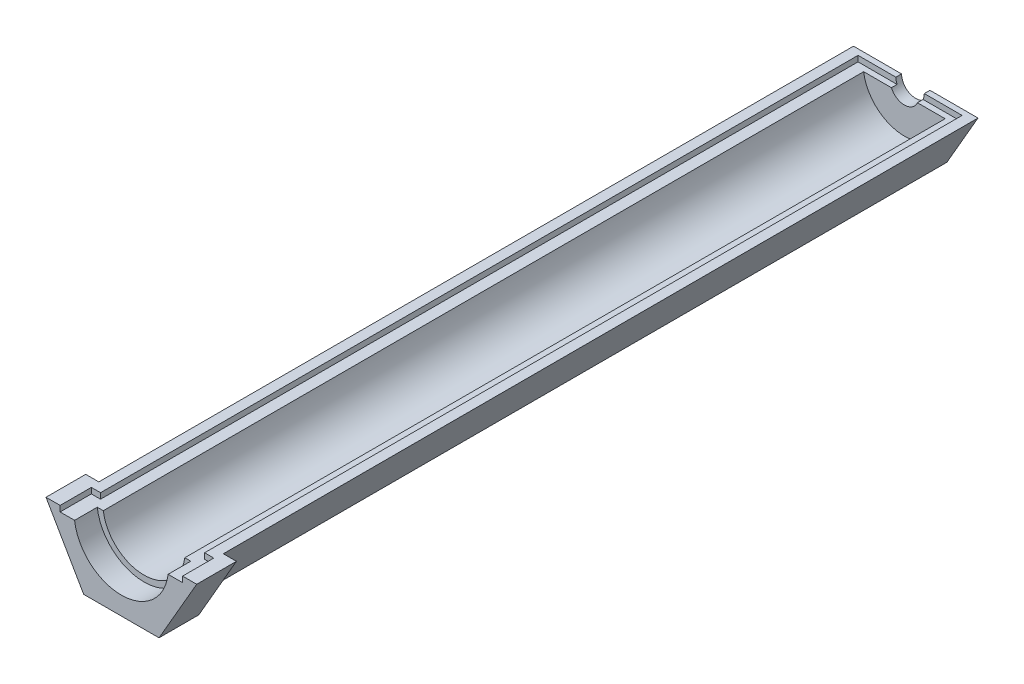
ISO-10303-21;
HEADER;
FILE_DESCRIPTION(('STEP AP214'),'2;1');
FILE_NAME('part.step','',(''),(''),'','','');
FILE_SCHEMA(('AUTOMOTIVE_DESIGN { 1 0 10303 214 1 1 1 1 }'));
ENDSEC;
DATA;
#1=APPLICATION_CONTEXT('core data for automotive mechanical design processes');
#2=APPLICATION_PROTOCOL_DEFINITION('international standard','automotive_design',2000,#1);
#3=PRODUCT_CONTEXT('',#1,'mechanical');
#4=PRODUCT('Part','Part','',(#3));
#5=PRODUCT_RELATED_PRODUCT_CATEGORY('part','',(#4));
#6=PRODUCT_DEFINITION_FORMATION('','',#4);
#7=PRODUCT_DEFINITION_CONTEXT('part definition',#1,'design');
#8=PRODUCT_DEFINITION('design','',#6,#7);
#9=PRODUCT_DEFINITION_SHAPE('','',#8);
#10=(LENGTH_UNIT() NAMED_UNIT(*) SI_UNIT(.MILLI.,.METRE.));
#11=(NAMED_UNIT(*) PLANE_ANGLE_UNIT() SI_UNIT($,.RADIAN.));
#12=(NAMED_UNIT(*) SI_UNIT($,.STERADIAN.) SOLID_ANGLE_UNIT());
#13=UNCERTAINTY_MEASURE_WITH_UNIT(LENGTH_MEASURE(1.E-05),#10,'distance_accuracy_value','');
#14=(GEOMETRIC_REPRESENTATION_CONTEXT(3) GLOBAL_UNCERTAINTY_ASSIGNED_CONTEXT((#13)) GLOBAL_UNIT_ASSIGNED_CONTEXT((#10,
#11,#12)) REPRESENTATION_CONTEXT('',''));
#15=CARTESIAN_POINT('',(0.,0.,0.));
#16=DIRECTION('',(0.,0.,1.));
#17=DIRECTION('',(1.,0.,0.));
#18=AXIS2_PLACEMENT_3D('',#15,#16,#17);
#19=CARTESIAN_POINT('',(7.25,0.,136.));
#20=DIRECTION('',(0.,-1.,0.));
#21=DIRECTION('',(1.,0.,0.));
#22=AXIS2_PLACEMENT_3D('',#19,#20,#21);
#23=PLANE('',#22);
#24=DIRECTION('',(-1.,0.,0.));
#25=VECTOR('',#24,1.);
#26=CARTESIAN_POINT('',(9.16965511460289,0.,1.));
#27=LINE('',#26,#25);
#28=CARTESIAN_POINT('',(-2.5,0.,1.));
#29=VERTEX_POINT('',#28);
#30=CARTESIAN_POINT('',(-9.16965511460289,0.,1.));
#31=VERTEX_POINT('',#30);
#32=EDGE_CURVE('E210',#29,#31,#27,.T.);
#33=ORIENTED_EDGE('',*,*,#32,.F.);
#34=DIRECTION('',(0.,0.,-1.));
#35=VECTOR('',#34,1.);
#36=CARTESIAN_POINT('',(-2.5,0.,9.07106781186547));
#37=LINE('',#36,#35);
#38=CARTESIAN_POINT('',(-2.5,0.,0.));
#39=VERTEX_POINT('',#38);
#40=EDGE_CURVE('E50',#29,#39,#37,.T.);
#41=ORIENTED_EDGE('',*,*,#40,.T.);
#42=DIRECTION('',(-1.,0.,0.));
#43=VECTOR('',#42,1.);
#44=CARTESIAN_POINT('',(7.25,0.,0.));
#45=LINE('',#44,#43);
#46=CARTESIAN_POINT('',(-10.9696551146029,0.,0.));
#47=VERTEX_POINT('',#46);
#48=EDGE_CURVE('E207',#39,#47,#45,.T.);
#49=ORIENTED_EDGE('',*,*,#48,.T.);
#50=DIRECTION('',(0.,0.,-1.));
#51=VECTOR('',#50,1.);
#52=CARTESIAN_POINT('',(-10.9696551146029,0.,136.));
#53=LINE('',#52,#51);
#54=CARTESIAN_POINT('',(-10.9696551146029,0.,133.));
#55=VERTEX_POINT('',#54);
#56=EDGE_CURVE('E234',#55,#47,#53,.T.);
#57=ORIENTED_EDGE('',*,*,#56,.F.);
#58=DIRECTION('',(-1.,0.,0.));
#59=VECTOR('',#58,1.);
#60=CARTESIAN_POINT('',(-8.30000000000002,0.,133.));
#61=LINE('',#60,#59);
#62=CARTESIAN_POINT('',(-13.2790561913619,0.,133.));
#63=VERTEX_POINT('',#62);
#64=EDGE_CURVE('E332',#55,#63,#61,.T.);
#65=ORIENTED_EDGE('',*,*,#64,.T.);
#66=DIRECTION('',(0.,0.,-1.));
#67=VECTOR('',#66,1.);
#68=CARTESIAN_POINT('',(-13.2790561913619,0.,140.));
#69=LINE('',#68,#67);
#70=CARTESIAN_POINT('',(-13.2790561913619,0.,140.));
#71=VERTEX_POINT('',#70);
#72=EDGE_CURVE('E366',#71,#63,#69,.T.);
#73=ORIENTED_EDGE('',*,*,#72,.F.);
#74=DIRECTION('',(-1.,0.,0.));
#75=VECTOR('',#74,1.);
#76=CARTESIAN_POINT('',(-8.30000000000002,0.,140.));
#77=LINE('',#76,#75);
#78=CARTESIAN_POINT('',(-10.789528095681,0.,140.));
#79=VERTEX_POINT('',#78);
#80=EDGE_CURVE('E336',#79,#71,#77,.T.);
#81=ORIENTED_EDGE('',*,*,#80,.F.);
#82=DIRECTION('',(0.,0.,1.));
#83=VECTOR('',#82,1.);
#84=CARTESIAN_POINT('',(-10.789528095681,0.,140.));
#85=LINE('',#84,#83);
#86=CARTESIAN_POINT('',(-10.789528095681,0.,134.5));
#87=VERTEX_POINT('',#86);
#88=EDGE_CURVE('E264',#87,#79,#85,.T.);
#89=ORIENTED_EDGE('',*,*,#88,.F.);
#90=DIRECTION('',(-1.,0.,0.));
#91=VECTOR('',#90,1.);
#92=CARTESIAN_POINT('',(-10.789528095681,0.,134.5));
#93=LINE('',#92,#91);
#94=CARTESIAN_POINT('',(-9.16965511460287,0.,134.5));
#95=VERTEX_POINT('',#94);
#96=EDGE_CURVE('E298',#95,#87,#93,.T.);
#97=ORIENTED_EDGE('',*,*,#96,.F.);
#98=DIRECTION('',(0.,0.,1.));
#99=VECTOR('',#98,1.);
#100=CARTESIAN_POINT('',(-9.16965511460289,0.,1.));
#101=LINE('',#100,#99);
#102=EDGE_CURVE('E295',#31,#95,#101,.T.);
#103=ORIENTED_EDGE('',*,*,#102,.F.);
#104=EDGE_LOOP('',(#33,#41,#49,#57,#65,#73,#81,#89,#97,#103));
#105=FACE_BOUND('',#104,.T.);
#106=ADVANCED_FACE('F35',(#105),#23,.F.);
#107=CARTESIAN_POINT('',(0.,-1.,0.));
#108=DIRECTION('',(0.,1.,0.));
#109=DIRECTION('',(-1.,0.,0.));
#110=AXIS2_PLACEMENT_3D('',#107,#108,#109);
#111=PLANE('',#110);
#112=DIRECTION('',(0.,0.,-1.));
#113=VECTOR('',#112,1.);
#114=CARTESIAN_POINT('',(2.29128784747792,-0.999999999999999,9.07106781186547));
#115=LINE('',#114,#113);
#116=CARTESIAN_POINT('',(2.29128784747792,-0.999999999999999,2.));
#117=VERTEX_POINT('',#116);
#118=CARTESIAN_POINT('',(2.29128784747792,-0.999999999999999,1.));
#119=VERTEX_POINT('',#118);
#120=EDGE_CURVE('E211',#117,#119,#115,.T.);
#121=ORIENTED_EDGE('',*,*,#120,.F.);
#122=DIRECTION('',(-1.,0.,0.));
#123=VECTOR('',#122,1.);
#124=CARTESIAN_POINT('',(0.,-1.,2.));
#125=LINE('',#124,#123);
#126=CARTESIAN_POINT('',(7.18070330817254,-0.999999999999996,2.));
#127=VERTEX_POINT('',#126);
#128=EDGE_CURVE('E326',#127,#117,#125,.T.);
#129=ORIENTED_EDGE('',*,*,#128,.F.);
#130=DIRECTION('',(0.,0.,-1.));
#131=VECTOR('',#130,1.);
#132=CARTESIAN_POINT('',(7.18070330817254,-0.999999999999996,136.));
#133=LINE('',#132,#131);
#134=CARTESIAN_POINT('',(7.18070330817254,-0.999999999999996,136.));
#135=VERTEX_POINT('',#134);
#136=EDGE_CURVE('E329',#127,#135,#133,.F.);
#137=ORIENTED_EDGE('',*,*,#136,.T.);
#138=DIRECTION('',(-1.,0.,0.));
#139=VECTOR('',#138,1.);
#140=CARTESIAN_POINT('',(0.,-1.,136.));
#141=LINE('',#140,#139);
#142=CARTESIAN_POINT('',(8.23953882204581,-0.999999999999996,136.));
#143=VERTEX_POINT('',#142);
#144=EDGE_CURVE('E324',#143,#135,#141,.T.);
#145=ORIENTED_EDGE('',*,*,#144,.F.);
#146=DIRECTION('',(0.,0.,-1.));
#147=VECTOR('',#146,1.);
#148=CARTESIAN_POINT('',(8.23953882204581,-0.999999999999996,140.));
#149=LINE('',#148,#147);
#150=CARTESIAN_POINT('',(8.23953882204581,-0.999999999999996,140.));
#151=VERTEX_POINT('',#150);
#152=EDGE_CURVE('E58',#143,#151,#149,.F.);
#153=ORIENTED_EDGE('',*,*,#152,.T.);
#154=DIRECTION('',(1.,0.,0.));
#155=VECTOR('',#154,1.);
#156=CARTESIAN_POINT('',(0.,-1.,140.));
#157=LINE('',#156,#155);
#158=CARTESIAN_POINT('',(10.7895280956809,-0.999999999999995,140.));
#159=VERTEX_POINT('',#158);
#160=EDGE_CURVE('E238',#151,#159,#157,.T.);
#161=ORIENTED_EDGE('',*,*,#160,.T.);
#162=DIRECTION('',(0.,0.,-1.));
#163=VECTOR('',#162,1.);
#164=CARTESIAN_POINT('',(10.7895280956809,-0.999999999999995,140.));
#165=LINE('',#164,#163);
#166=CARTESIAN_POINT('',(10.7895280956809,-0.999999999999995,134.5));
#167=VERTEX_POINT('',#166);
#168=EDGE_CURVE('E261',#159,#167,#165,.T.);
#169=ORIENTED_EDGE('',*,*,#168,.T.);
#170=DIRECTION('',(-1.,0.,0.));
#171=VECTOR('',#170,1.);
#172=CARTESIAN_POINT('',(10.7895280956809,-0.999999999999995,134.5));
#173=LINE('',#172,#171);
#174=CARTESIAN_POINT('',(9.16965511460289,-0.999999999999995,134.5));
#175=VERTEX_POINT('',#174);
#176=EDGE_CURVE('E263',#167,#175,#173,.T.);
#177=ORIENTED_EDGE('',*,*,#176,.T.);
#178=DIRECTION('',(0.,0.,-1.));
#179=VECTOR('',#178,1.);
#180=CARTESIAN_POINT('',(9.16965511460289,-0.999999999999995,134.5));
#181=LINE('',#180,#179);
#182=CARTESIAN_POINT('',(9.16965511460289,-0.999999999999995,1.));
#183=VERTEX_POINT('',#182);
#184=EDGE_CURVE('E267',#175,#183,#181,.T.);
#185=ORIENTED_EDGE('',*,*,#184,.T.);
#186=DIRECTION('',(-1.,0.,0.));
#187=VECTOR('',#186,1.);
#188=CARTESIAN_POINT('',(9.16965511460289,-0.999999999999995,1.));
#189=LINE('',#188,#187);
#190=EDGE_CURVE('E270',#183,#119,#189,.T.);
#191=ORIENTED_EDGE('',*,*,#190,.T.);
#192=EDGE_LOOP('',(#121,#129,#137,#145,#153,#161,#169,#177,#185,#191));
#193=FACE_BOUND('',#192,.T.);
#194=ADVANCED_FACE('F430',(#193),#111,.T.);
#195=CARTESIAN_POINT('',(9.16965511460289,-0.999999999999995,1.));
#196=DIRECTION('',(0.,0.,-1.));
#197=DIRECTION('',(-1.,0.,0.));
#198=AXIS2_PLACEMENT_3D('',#195,#196,#197);
#199=PLANE('',#198);
#200=CARTESIAN_POINT('',(9.16965511460289,0.,1.));
#201=VERTEX_POINT('',#200);
#202=CARTESIAN_POINT('',(2.5,0.,1.));
#203=VERTEX_POINT('',#202);
#204=EDGE_CURVE('E292',#201,#203,#27,.T.);
#205=ORIENTED_EDGE('',*,*,#204,.T.);
#206=CARTESIAN_POINT('',(0.,0.,1.));
#207=DIRECTION('',(0.,0.,-1.));
#208=DIRECTION('',(-1.,0.,0.));
#209=AXIS2_PLACEMENT_3D('',#206,#207,#208);
#210=CIRCLE('',#209,2.5);
#211=EDGE_CURVE('E11',#203,#119,#210,.T.);
#212=ORIENTED_EDGE('',*,*,#211,.T.);
#213=ORIENTED_EDGE('',*,*,#190,.F.);
#214=DIRECTION('',(0.,1.,0.));
#215=VECTOR('',#214,1.);
#216=CARTESIAN_POINT('',(9.16965511460289,-0.999999999999995,1.));
#217=LINE('',#216,#215);
#218=EDGE_CURVE('E314',#183,#201,#217,.T.);
#219=ORIENTED_EDGE('',*,*,#218,.T.);
#220=EDGE_LOOP('',(#205,#212,#213,#219));
#221=FACE_BOUND('',#220,.T.);
#222=ADVANCED_FACE('F435',(#221),#199,.F.);
#223=CARTESIAN_POINT('',(0.,0.,136.));
#224=DIRECTION('',(0.,0.,1.));
#225=DIRECTION('',(1.,0.,0.));
#226=AXIS2_PLACEMENT_3D('',#223,#224,#225);
#227=PLANE('',#226);
#228=CARTESIAN_POINT('',(0.,0.,136.));
#229=DIRECTION('',(0.,0.,1.));
#230=DIRECTION('',(1.,0.,0.));
#231=AXIS2_PLACEMENT_3D('',#228,#229,#230);
#232=CIRCLE('',#231,8.3);
#233=CARTESIAN_POINT('',(-8.23953882204581,-1.,136.));
#234=VERTEX_POINT('',#233);
#235=EDGE_CURVE('E236',#234,#143,#232,.T.);
#236=ORIENTED_EDGE('',*,*,#235,.T.);
#237=ORIENTED_EDGE('',*,*,#144,.T.);
#238=CARTESIAN_POINT('',(0.,0.,136.));
#239=DIRECTION('',(0.,0.,-1.));
#240=DIRECTION('',(1.,0.,0.));
#241=AXIS2_PLACEMENT_3D('',#238,#239,#240);
#242=CIRCLE('',#241,7.25);
#243=CARTESIAN_POINT('',(-7.18070330817253,-1.,136.));
#244=VERTEX_POINT('',#243);
#245=EDGE_CURVE('E222',#135,#244,#242,.T.);
#246=ORIENTED_EDGE('',*,*,#245,.T.);
#247=EDGE_CURVE('E320',#244,#234,#141,.T.);
#248=ORIENTED_EDGE('',*,*,#247,.T.);
#249=EDGE_LOOP('',(#236,#237,#246,#248));
#250=FACE_BOUND('',#249,.T.);
#251=ADVANCED_FACE('F544',(#250),#227,.T.);
#252=CARTESIAN_POINT('',(0.,0.,136.));
#253=DIRECTION('',(0.,0.,-1.));
#254=DIRECTION('',(-1.,0.,0.));
#255=AXIS2_PLACEMENT_3D('',#252,#253,#254);
#256=CYLINDRICAL_SURFACE('',#255,7.25);
#257=ORIENTED_EDGE('',*,*,#136,.F.);
#258=CARTESIAN_POINT('',(0.,0.,2.));
#259=DIRECTION('',(0.,0.,1.));
#260=DIRECTION('',(1.,0.,0.));
#261=AXIS2_PLACEMENT_3D('',#258,#259,#260);
#262=CIRCLE('',#261,7.25);
#263=CARTESIAN_POINT('',(-7.18070330817253,-1.,2.));
#264=VERTEX_POINT('',#263);
#265=EDGE_CURVE('E375',#264,#127,#262,.T.);
#266=ORIENTED_EDGE('',*,*,#265,.F.);
#267=DIRECTION('',(0.,0.,-1.));
#268=VECTOR('',#267,1.);
#269=CARTESIAN_POINT('',(-7.18070330817253,-1.,136.));
#270=LINE('',#269,#268);
#271=EDGE_CURVE('E323',#244,#264,#270,.T.);
#272=ORIENTED_EDGE('',*,*,#271,.F.);
#273=ORIENTED_EDGE('',*,*,#245,.F.);
#274=EDGE_LOOP('',(#257,#266,#272,#273));
#275=FACE_BOUND('',#274,.T.);
#276=ADVANCED_FACE('F37',(#275),#256,.F.);
#277=CARTESIAN_POINT('',(0.,0.,2.));
#278=DIRECTION('',(0.,0.,1.));
#279=DIRECTION('',(1.,0.,0.));
#280=AXIS2_PLACEMENT_3D('',#277,#278,#279);
#281=PLANE('',#280);
#282=CARTESIAN_POINT('',(0.,0.,2.));
#283=DIRECTION('',(0.,0.,1.));
#284=DIRECTION('',(1.,0.,0.));
#285=AXIS2_PLACEMENT_3D('',#282,#283,#284);
#286=CIRCLE('',#285,2.5);
#287=CARTESIAN_POINT('',(-2.29128784747792,-1.,2.));
#288=VERTEX_POINT('',#287);
#289=EDGE_CURVE('E202',#117,#288,#286,.F.);
#290=ORIENTED_EDGE('',*,*,#289,.T.);
#291=EDGE_CURVE('E254',#288,#264,#125,.T.);
#292=ORIENTED_EDGE('',*,*,#291,.T.);
#293=ORIENTED_EDGE('',*,*,#265,.T.);
#294=ORIENTED_EDGE('',*,*,#128,.T.);
#295=EDGE_LOOP('',(#290,#292,#293,#294));
#296=FACE_BOUND('',#295,.T.);
#297=ADVANCED_FACE('F426',(#296),#281,.T.);
#298=CARTESIAN_POINT('',(0.,0.,140.));
#299=DIRECTION('',(0.,0.,-1.));
#300=DIRECTION('',(-1.,0.,0.));
#301=AXIS2_PLACEMENT_3D('',#298,#299,#300);
#302=CYLINDRICAL_SURFACE('',#301,8.3);
#303=ORIENTED_EDGE('',*,*,#152,.F.);
#304=ORIENTED_EDGE('',*,*,#235,.F.);
#305=DIRECTION('',(0.,0.,-1.));
#306=VECTOR('',#305,1.);
#307=CARTESIAN_POINT('',(-8.23953882204581,-1.,140.));
#308=LINE('',#307,#306);
#309=CARTESIAN_POINT('',(-8.23953882204581,-1.,140.));
#310=VERTEX_POINT('',#309);
#311=EDGE_CURVE('E304',#310,#234,#308,.T.);
#312=ORIENTED_EDGE('',*,*,#311,.F.);
#313=CARTESIAN_POINT('',(0.,0.,140.));
#314=DIRECTION('',(0.,0.,-1.));
#315=DIRECTION('',(-1.,0.,0.));
#316=AXIS2_PLACEMENT_3D('',#313,#314,#315);
#317=CIRCLE('',#316,8.3);
#318=EDGE_CURVE('E333',#151,#310,#317,.T.);
#319=ORIENTED_EDGE('',*,*,#318,.F.);
#320=EDGE_LOOP('',(#303,#304,#312,#319));
#321=FACE_BOUND('',#320,.T.);
#322=ADVANCED_FACE('F420',(#321),#302,.F.);
#323=CARTESIAN_POINT('',(-10.9696551146029,0.,136.));
#324=DIRECTION('',(0.866025403784439,0.5,0.));
#325=DIRECTION('',(-0.5,0.866025403784438,0.));
#326=AXIS2_PLACEMENT_3D('',#323,#324,#325);
#327=PLANE('',#326);
#328=DIRECTION('',(0.,0.,-1.));
#329=VECTOR('',#328,1.);
#330=CARTESIAN_POINT('',(-5.48482755730144,-9.5,136.));
#331=LINE('',#330,#329);
#332=CARTESIAN_POINT('',(-5.48482755730144,-9.5,133.));
#333=VERTEX_POINT('',#332);
#334=CARTESIAN_POINT('',(-5.48482755730144,-9.5,0.));
#335=VERTEX_POINT('',#334);
#336=EDGE_CURVE('E232',#333,#335,#331,.T.);
#337=ORIENTED_EDGE('',*,*,#336,.F.);
#338=DIRECTION('',(-0.5,0.866025403784438,0.));
#339=VECTOR('',#338,1.);
#340=CARTESIAN_POINT('',(-10.9696551146029,0.,133.));
#341=LINE('',#340,#339);
#342=EDGE_CURVE('E373',#333,#55,#341,.T.);
#343=ORIENTED_EDGE('',*,*,#342,.T.);
#344=ORIENTED_EDGE('',*,*,#56,.T.);
#345=DIRECTION('',(0.5,-0.866025403784438,0.));
#346=VECTOR('',#345,1.);
#347=CARTESIAN_POINT('',(-10.9696551146029,0.,0.));
#348=LINE('',#347,#346);
#349=EDGE_CURVE('E218',#47,#335,#348,.T.);
#350=ORIENTED_EDGE('',*,*,#349,.T.);
#351=EDGE_LOOP('',(#337,#343,#344,#350));
#352=FACE_BOUND('',#351,.T.);
#353=ADVANCED_FACE('F418',(#352),#327,.F.);
#354=CARTESIAN_POINT('',(-5.48482755730144,-9.5,136.));
#355=DIRECTION('',(0.,1.,0.));
#356=DIRECTION('',(-1.,0.,0.));
#357=AXIS2_PLACEMENT_3D('',#354,#355,#356);
#358=PLANE('',#357);
#359=DIRECTION('',(0.,0.,-1.));
#360=VECTOR('',#359,1.);
#361=CARTESIAN_POINT('',(5.48482755730144,-9.5,136.));
#362=LINE('',#361,#360);
#363=CARTESIAN_POINT('',(5.48482755730144,-9.5,133.));
#364=VERTEX_POINT('',#363);
#365=CARTESIAN_POINT('',(5.48482755730144,-9.5,0.));
#366=VERTEX_POINT('',#365);
#367=EDGE_CURVE('E230',#364,#366,#362,.T.);
#368=ORIENTED_EDGE('',*,*,#367,.F.);
#369=DIRECTION('',(-1.,0.,0.));
#370=VECTOR('',#369,1.);
#371=CARTESIAN_POINT('',(-5.48482755730144,-9.5,133.));
#372=LINE('',#371,#370);
#373=EDGE_CURVE('E371',#364,#333,#372,.T.);
#374=ORIENTED_EDGE('',*,*,#373,.T.);
#375=ORIENTED_EDGE('',*,*,#336,.T.);
#376=DIRECTION('',(1.,0.,0.));
#377=VECTOR('',#376,1.);
#378=CARTESIAN_POINT('',(-5.48482755730144,-9.5,0.));
#379=LINE('',#378,#377);
#380=EDGE_CURVE('E224',#335,#366,#379,.T.);
#381=ORIENTED_EDGE('',*,*,#380,.T.);
#382=EDGE_LOOP('',(#368,#374,#375,#381));
#383=FACE_BOUND('',#382,.T.);
#384=ADVANCED_FACE('F384',(#383),#358,.F.);
#385=CARTESIAN_POINT('',(5.48482755730144,-9.5,136.));
#386=DIRECTION('',(-0.866025403784439,0.5,0.));
#387=DIRECTION('',(-0.5,-0.866025403784439,0.));
#388=AXIS2_PLACEMENT_3D('',#385,#386,#387);
#389=PLANE('',#388);
#390=DIRECTION('',(0.,0.,-1.));
#391=VECTOR('',#390,1.);
#392=CARTESIAN_POINT('',(10.9696551146029,0.,136.));
#393=LINE('',#392,#391);
#394=CARTESIAN_POINT('',(10.9696551146029,0.,133.));
#395=VERTEX_POINT('',#394);
#396=CARTESIAN_POINT('',(10.9696551146029,0.,0.));
#397=VERTEX_POINT('',#396);
#398=EDGE_CURVE('E228',#395,#397,#393,.T.);
#399=ORIENTED_EDGE('',*,*,#398,.F.);
#400=DIRECTION('',(-0.5,-0.866025403784439,0.));
#401=VECTOR('',#400,1.);
#402=CARTESIAN_POINT('',(5.48482755730144,-9.5,133.));
#403=LINE('',#402,#401);
#404=EDGE_CURVE('E369',#395,#364,#403,.T.);
#405=ORIENTED_EDGE('',*,*,#404,.T.);
#406=ORIENTED_EDGE('',*,*,#367,.T.);
#407=DIRECTION('',(0.5,0.866025403784439,0.));
#408=VECTOR('',#407,1.);
#409=CARTESIAN_POINT('',(5.48482755730144,-9.5,0.));
#410=LINE('',#409,#408);
#411=EDGE_CURVE('E220',#366,#397,#410,.T.);
#412=ORIENTED_EDGE('',*,*,#411,.T.);
#413=EDGE_LOOP('',(#399,#405,#406,#412));
#414=FACE_BOUND('',#413,.T.);
#415=ADVANCED_FACE('F388',(#414),#389,.F.);
#416=CARTESIAN_POINT('',(2.5,0.,0.));
#417=VERTEX_POINT('',#416);
#418=EDGE_CURVE('E219',#397,#417,#45,.T.);
#419=ORIENTED_EDGE('',*,*,#418,.T.);
#420=DIRECTION('',(0.,0.,-1.));
#421=VECTOR('',#420,1.);
#422=CARTESIAN_POINT('',(2.5,0.,9.07106781186547));
#423=LINE('',#422,#421);
#424=EDGE_CURVE('E197',#417,#203,#423,.F.);
#425=ORIENTED_EDGE('',*,*,#424,.T.);
#426=ORIENTED_EDGE('',*,*,#204,.F.);
#427=DIRECTION('',(0.,0.,-1.));
#428=VECTOR('',#427,1.);
#429=CARTESIAN_POINT('',(9.16965511460289,0.,134.5));
#430=LINE('',#429,#428);
#431=CARTESIAN_POINT('',(9.16965511460289,0.,134.5));
#432=VERTEX_POINT('',#431);
#433=EDGE_CURVE('E289',#432,#201,#430,.T.);
#434=ORIENTED_EDGE('',*,*,#433,.F.);
#435=DIRECTION('',(-1.,0.,0.));
#436=VECTOR('',#435,1.);
#437=CARTESIAN_POINT('',(10.7895280956809,0.,134.5));
#438=LINE('',#437,#436);
#439=CARTESIAN_POINT('',(10.7895280956809,0.,134.5));
#440=VERTEX_POINT('',#439);
#441=EDGE_CURVE('E286',#440,#432,#438,.T.);
#442=ORIENTED_EDGE('',*,*,#441,.F.);
#443=DIRECTION('',(0.,0.,-1.));
#444=VECTOR('',#443,1.);
#445=CARTESIAN_POINT('',(10.7895280956809,0.,140.));
#446=LINE('',#445,#444);
#447=CARTESIAN_POINT('',(10.7895280956809,0.,140.));
#448=VERTEX_POINT('',#447);
#449=EDGE_CURVE('E260',#448,#440,#446,.T.);
#450=ORIENTED_EDGE('',*,*,#449,.F.);
#451=DIRECTION('',(-1.,0.,0.));
#452=VECTOR('',#451,1.);
#453=CARTESIAN_POINT('',(8.29999999999998,0.,140.));
#454=LINE('',#453,#452);
#455=CARTESIAN_POINT('',(13.2790561913618,0.,140.));
#456=VERTEX_POINT('',#455);
#457=EDGE_CURVE('E345',#456,#448,#454,.T.);
#458=ORIENTED_EDGE('',*,*,#457,.F.);
#459=DIRECTION('',(0.,0.,-1.));
#460=VECTOR('',#459,1.);
#461=CARTESIAN_POINT('',(13.2790561913618,0.,140.));
#462=LINE('',#461,#460);
#463=CARTESIAN_POINT('',(13.2790561913618,0.,133.));
#464=VERTEX_POINT('',#463);
#465=EDGE_CURVE('E348',#456,#464,#462,.T.);
#466=ORIENTED_EDGE('',*,*,#465,.T.);
#467=DIRECTION('',(-1.,0.,0.));
#468=VECTOR('',#467,1.);
#469=CARTESIAN_POINT('',(8.29999999999998,0.,133.));
#470=LINE('',#469,#468);
#471=EDGE_CURVE('E337',#464,#395,#470,.T.);
#472=ORIENTED_EDGE('',*,*,#471,.T.);
#473=ORIENTED_EDGE('',*,*,#398,.T.);
#474=EDGE_LOOP('',(#419,#425,#426,#434,#442,#450,#458,#466,#472,#473));
#475=FACE_BOUND('',#474,.T.);
#476=ADVANCED_FACE('F396',(#475),#23,.F.);
#477=CARTESIAN_POINT('',(0.,0.,0.));
#478=DIRECTION('',(0.,0.,1.));
#479=DIRECTION('',(1.,0.,0.));
#480=AXIS2_PLACEMENT_3D('',#477,#478,#479);
#481=PLANE('',#480);
#482=ORIENTED_EDGE('',*,*,#48,.F.);
#483=CARTESIAN_POINT('',(0.,0.,0.));
#484=DIRECTION('',(0.,0.,-1.));
#485=DIRECTION('',(-1.,0.,0.));
#486=AXIS2_PLACEMENT_3D('',#483,#484,#485);
#487=CIRCLE('',#486,2.5);
#488=EDGE_CURVE('E194',#417,#39,#487,.T.);
#489=ORIENTED_EDGE('',*,*,#488,.F.);
#490=ORIENTED_EDGE('',*,*,#418,.F.);
#491=ORIENTED_EDGE('',*,*,#411,.F.);
#492=ORIENTED_EDGE('',*,*,#380,.F.);
#493=ORIENTED_EDGE('',*,*,#349,.F.);
#494=EDGE_LOOP('',(#482,#489,#490,#491,#492,#493));
#495=FACE_BOUND('',#494,.T.);
#496=ADVANCED_FACE('F215',(#495),#481,.F.);
#497=CARTESIAN_POINT('',(0.,0.,133.));
#498=DIRECTION('',(0.,0.,-1.));
#499=DIRECTION('',(-1.,0.,0.));
#500=AXIS2_PLACEMENT_3D('',#497,#498,#499);
#501=PLANE('',#500);
#502=ORIENTED_EDGE('',*,*,#342,.F.);
#503=ORIENTED_EDGE('',*,*,#373,.F.);
#504=ORIENTED_EDGE('',*,*,#404,.F.);
#505=ORIENTED_EDGE('',*,*,#471,.F.);
#506=DIRECTION('',(0.499999999999997,0.86602540378444,0.));
#507=VECTOR('',#506,1.);
#508=CARTESIAN_POINT('',(6.63952809568095,-11.5000000000004,133.));
#509=LINE('',#508,#507);
#510=CARTESIAN_POINT('',(6.63952809568095,-11.5000000000004,133.));
#511=VERTEX_POINT('',#510);
#512=EDGE_CURVE('E354',#511,#464,#509,.T.);
#513=ORIENTED_EDGE('',*,*,#512,.F.);
#514=DIRECTION('',(1.,0.,0.));
#515=VECTOR('',#514,1.);
#516=CARTESIAN_POINT('',(-6.63952809568092,-11.5000000000004,133.));
#517=LINE('',#516,#515);
#518=CARTESIAN_POINT('',(-6.63952809568092,-11.5000000000004,133.));
#519=VERTEX_POINT('',#518);
#520=EDGE_CURVE('E352',#519,#511,#517,.T.);
#521=ORIENTED_EDGE('',*,*,#520,.F.);
#522=DIRECTION('',(0.500000000000002,-0.866025403784437,0.));
#523=VECTOR('',#522,1.);
#524=CARTESIAN_POINT('',(-13.2790561913619,0.,133.));
#525=LINE('',#524,#523);
#526=EDGE_CURVE('E350',#63,#519,#525,.T.);
#527=ORIENTED_EDGE('',*,*,#526,.F.);
#528=ORIENTED_EDGE('',*,*,#64,.F.);
#529=EDGE_LOOP('',(#502,#503,#504,#505,#513,#521,#527,#528));
#530=FACE_BOUND('',#529,.T.);
#531=ADVANCED_FACE('F393',(#530),#501,.T.);
#532=CARTESIAN_POINT('',(-13.2790561913619,0.,140.));
#533=DIRECTION('',(0.866025403784437,0.500000000000002,0.));
#534=DIRECTION('',(-0.500000000000002,0.866025403784437,0.));
#535=AXIS2_PLACEMENT_3D('',#532,#533,#534);
#536=PLANE('',#535);
#537=ORIENTED_EDGE('',*,*,#526,.T.);
#538=DIRECTION('',(0.,0.,-1.));
#539=VECTOR('',#538,1.);
#540=CARTESIAN_POINT('',(-6.63952809568092,-11.5000000000004,140.));
#541=LINE('',#540,#539);
#542=CARTESIAN_POINT('',(-6.63952809568092,-11.5000000000004,140.));
#543=VERTEX_POINT('',#542);
#544=EDGE_CURVE('E363',#543,#519,#541,.T.);
#545=ORIENTED_EDGE('',*,*,#544,.F.);
#546=DIRECTION('',(0.500000000000002,-0.866025403784437,0.));
#547=VECTOR('',#546,1.);
#548=CARTESIAN_POINT('',(-13.2790561913619,0.,140.));
#549=LINE('',#548,#547);
#550=EDGE_CURVE('E339',#71,#543,#549,.T.);
#551=ORIENTED_EDGE('',*,*,#550,.F.);
#552=ORIENTED_EDGE('',*,*,#72,.T.);
#553=EDGE_LOOP('',(#537,#545,#551,#552));
#554=FACE_BOUND('',#553,.T.);
#555=ADVANCED_FACE('F413',(#554),#536,.F.);
#556=CARTESIAN_POINT('',(-6.63952809568092,-11.5000000000004,140.));
#557=DIRECTION('',(0.,1.,0.));
#558=DIRECTION('',(0.,0.,1.));
#559=AXIS2_PLACEMENT_3D('',#556,#557,#558);
#560=PLANE('',#559);
#561=ORIENTED_EDGE('',*,*,#520,.T.);
#562=DIRECTION('',(0.,0.,-1.));
#563=VECTOR('',#562,1.);
#564=CARTESIAN_POINT('',(6.63952809568095,-11.5000000000004,140.));
#565=LINE('',#564,#563);
#566=CARTESIAN_POINT('',(6.63952809568095,-11.5000000000004,140.));
#567=VERTEX_POINT('',#566);
#568=EDGE_CURVE('E360',#567,#511,#565,.T.);
#569=ORIENTED_EDGE('',*,*,#568,.F.);
#570=DIRECTION('',(1.,0.,0.));
#571=VECTOR('',#570,1.);
#572=CARTESIAN_POINT('',(-6.63952809568092,-11.5000000000004,140.));
#573=LINE('',#572,#571);
#574=EDGE_CURVE('E341',#543,#567,#573,.T.);
#575=ORIENTED_EDGE('',*,*,#574,.F.);
#576=ORIENTED_EDGE('',*,*,#544,.T.);
#577=EDGE_LOOP('',(#561,#569,#575,#576));
#578=FACE_BOUND('',#577,.T.);
#579=ADVANCED_FACE('F408',(#578),#560,.F.);
#580=CARTESIAN_POINT('',(6.63952809568095,-11.5000000000004,140.));
#581=DIRECTION('',(-0.86602540378444,0.499999999999997,0.));
#582=DIRECTION('',(-0.499999999999997,-0.86602540378444,0.));
#583=AXIS2_PLACEMENT_3D('',#580,#581,#582);
#584=PLANE('',#583);
#585=ORIENTED_EDGE('',*,*,#512,.T.);
#586=ORIENTED_EDGE('',*,*,#465,.F.);
#587=DIRECTION('',(0.499999999999997,0.86602540378444,0.));
#588=VECTOR('',#587,1.);
#589=CARTESIAN_POINT('',(6.63952809568095,-11.5000000000004,140.));
#590=LINE('',#589,#588);
#591=EDGE_CURVE('E343',#567,#456,#590,.T.);
#592=ORIENTED_EDGE('',*,*,#591,.F.);
#593=ORIENTED_EDGE('',*,*,#568,.T.);
#594=EDGE_LOOP('',(#585,#586,#592,#593));
#595=FACE_BOUND('',#594,.T.);
#596=ADVANCED_FACE('F402',(#595),#584,.F.);
#597=CARTESIAN_POINT('',(0.,0.,140.));
#598=DIRECTION('',(0.,0.,-1.));
#599=DIRECTION('',(-1.,0.,0.));
#600=AXIS2_PLACEMENT_3D('',#597,#598,#599);
#601=PLANE('',#600);
#602=DIRECTION('',(1.,0.,0.));
#603=VECTOR('',#602,1.);
#604=CARTESIAN_POINT('',(-10.789528095681,-1.00000000000001,140.));
#605=LINE('',#604,#603);
#606=CARTESIAN_POINT('',(-10.789528095681,-1.00000000000001,140.));
#607=VERTEX_POINT('',#606);
#608=EDGE_CURVE('E281',#607,#310,#605,.T.);
#609=ORIENTED_EDGE('',*,*,#608,.F.);
#610=DIRECTION('',(0.,1.,0.));
#611=VECTOR('',#610,1.);
#612=CARTESIAN_POINT('',(-10.789528095681,-1.00000000000001,140.));
#613=LINE('',#612,#611);
#614=EDGE_CURVE('E305',#607,#79,#613,.T.);
#615=ORIENTED_EDGE('',*,*,#614,.T.);
#616=ORIENTED_EDGE('',*,*,#80,.T.);
#617=ORIENTED_EDGE('',*,*,#550,.T.);
#618=ORIENTED_EDGE('',*,*,#574,.T.);
#619=ORIENTED_EDGE('',*,*,#591,.T.);
#620=ORIENTED_EDGE('',*,*,#457,.T.);
#621=DIRECTION('',(0.,1.,0.));
#622=VECTOR('',#621,1.);
#623=CARTESIAN_POINT('',(10.7895280956809,-0.999999999999995,140.));
#624=LINE('',#623,#622);
#625=EDGE_CURVE('E302',#159,#448,#624,.T.);
#626=ORIENTED_EDGE('',*,*,#625,.F.);
#627=ORIENTED_EDGE('',*,*,#160,.F.);
#628=ORIENTED_EDGE('',*,*,#318,.T.);
#629=EDGE_LOOP('',(#609,#615,#616,#617,#618,#619,#620,#626,#627,#628));
#630=FACE_BOUND('',#629,.T.);
#631=ADVANCED_FACE('F513',(#630),#601,.F.);
#632=DIRECTION('',(0.,0.,-1.));
#633=VECTOR('',#632,1.);
#634=CARTESIAN_POINT('',(-2.29128784747792,-1.,9.07106781186547));
#635=LINE('',#634,#633);
#636=CARTESIAN_POINT('',(-2.29128784747792,-1.,1.));
#637=VERTEX_POINT('',#636);
#638=EDGE_CURVE('E212',#637,#288,#635,.F.);
#639=ORIENTED_EDGE('',*,*,#638,.F.);
#640=CARTESIAN_POINT('',(-9.16965511460289,-1.,1.));
#641=VERTEX_POINT('',#640);
#642=EDGE_CURVE('E246',#637,#641,#189,.T.);
#643=ORIENTED_EDGE('',*,*,#642,.T.);
#644=DIRECTION('',(0.,0.,1.));
#645=VECTOR('',#644,1.);
#646=CARTESIAN_POINT('',(-9.16965511460289,-1.,1.));
#647=LINE('',#646,#645);
#648=CARTESIAN_POINT('',(-9.16965511460287,-1.,134.5));
#649=VERTEX_POINT('',#648);
#650=EDGE_CURVE('E273',#641,#649,#647,.T.);
#651=ORIENTED_EDGE('',*,*,#650,.T.);
#652=DIRECTION('',(-1.,0.,0.));
#653=VECTOR('',#652,1.);
#654=CARTESIAN_POINT('',(-10.789528095681,-1.00000000000001,134.5));
#655=LINE('',#654,#653);
#656=CARTESIAN_POINT('',(-10.789528095681,-1.00000000000001,134.5));
#657=VERTEX_POINT('',#656);
#658=EDGE_CURVE('E275',#649,#657,#655,.T.);
#659=ORIENTED_EDGE('',*,*,#658,.T.);
#660=DIRECTION('',(0.,0.,1.));
#661=VECTOR('',#660,1.);
#662=CARTESIAN_POINT('',(-10.789528095681,-1.00000000000001,140.));
#663=LINE('',#662,#661);
#664=EDGE_CURVE('E278',#657,#607,#663,.T.);
#665=ORIENTED_EDGE('',*,*,#664,.T.);
#666=ORIENTED_EDGE('',*,*,#608,.T.);
#667=ORIENTED_EDGE('',*,*,#311,.T.);
#668=ORIENTED_EDGE('',*,*,#247,.F.);
#669=ORIENTED_EDGE('',*,*,#271,.T.);
#670=ORIENTED_EDGE('',*,*,#291,.F.);
#671=EDGE_LOOP('',(#639,#643,#651,#659,#665,#666,#667,#668,#669,#670));
#672=FACE_BOUND('',#671,.T.);
#673=ADVANCED_FACE('F251',(#672),#111,.T.);
#674=CARTESIAN_POINT('',(10.7895280956809,-0.999999999999995,140.));
#675=DIRECTION('',(1.,0.,0.));
#676=DIRECTION('',(0.,1.,0.));
#677=AXIS2_PLACEMENT_3D('',#674,#675,#676);
#678=PLANE('',#677);
#679=ORIENTED_EDGE('',*,*,#449,.T.);
#680=DIRECTION('',(0.,1.,0.));
#681=VECTOR('',#680,1.);
#682=CARTESIAN_POINT('',(10.7895280956809,-0.999999999999995,134.5));
#683=LINE('',#682,#681);
#684=EDGE_CURVE('E283',#167,#440,#683,.T.);
#685=ORIENTED_EDGE('',*,*,#684,.F.);
#686=ORIENTED_EDGE('',*,*,#168,.F.);
#687=ORIENTED_EDGE('',*,*,#625,.T.);
#688=EDGE_LOOP('',(#679,#685,#686,#687));
#689=FACE_BOUND('',#688,.T.);
#690=ADVANCED_FACE('F558',(#689),#678,.F.);
#691=CARTESIAN_POINT('',(-10.789528095681,-1.00000000000001,140.));
#692=DIRECTION('',(-1.,0.,0.));
#693=DIRECTION('',(0.,-1.,0.));
#694=AXIS2_PLACEMENT_3D('',#691,#692,#693);
#695=PLANE('',#694);
#696=ORIENTED_EDGE('',*,*,#88,.T.);
#697=ORIENTED_EDGE('',*,*,#614,.F.);
#698=ORIENTED_EDGE('',*,*,#664,.F.);
#699=DIRECTION('',(0.,1.,0.));
#700=VECTOR('',#699,1.);
#701=CARTESIAN_POINT('',(-10.789528095681,-1.00000000000001,134.5));
#702=LINE('',#701,#700);
#703=EDGE_CURVE('E308',#657,#87,#702,.T.);
#704=ORIENTED_EDGE('',*,*,#703,.T.);
#705=EDGE_LOOP('',(#696,#697,#698,#704));
#706=FACE_BOUND('',#705,.T.);
#707=ADVANCED_FACE('F565',(#706),#695,.F.);
#708=CARTESIAN_POINT('',(-10.789528095681,-1.00000000000001,134.5));
#709=DIRECTION('',(0.,0.,-1.));
#710=DIRECTION('',(-1.,0.,0.));
#711=AXIS2_PLACEMENT_3D('',#708,#709,#710);
#712=PLANE('',#711);
#713=ORIENTED_EDGE('',*,*,#96,.T.);
#714=ORIENTED_EDGE('',*,*,#703,.F.);
#715=ORIENTED_EDGE('',*,*,#658,.F.);
#716=DIRECTION('',(0.,1.,0.));
#717=VECTOR('',#716,1.);
#718=CARTESIAN_POINT('',(-9.16965511460287,-1.,134.5));
#719=LINE('',#718,#717);
#720=EDGE_CURVE('E310',#649,#95,#719,.T.);
#721=ORIENTED_EDGE('',*,*,#720,.T.);
#722=EDGE_LOOP('',(#713,#714,#715,#721));
#723=FACE_BOUND('',#722,.T.);
#724=ADVANCED_FACE('F574',(#723),#712,.F.);
#725=CARTESIAN_POINT('',(-9.16965511460289,-1.,1.));
#726=DIRECTION('',(-1.,0.,0.));
#727=DIRECTION('',(0.,-1.,0.));
#728=AXIS2_PLACEMENT_3D('',#725,#726,#727);
#729=PLANE('',#728);
#730=ORIENTED_EDGE('',*,*,#102,.T.);
#731=ORIENTED_EDGE('',*,*,#720,.F.);
#732=ORIENTED_EDGE('',*,*,#650,.F.);
#733=DIRECTION('',(0.,1.,0.));
#734=VECTOR('',#733,1.);
#735=CARTESIAN_POINT('',(-9.16965511460289,-1.,1.));
#736=LINE('',#735,#734);
#737=EDGE_CURVE('E312',#641,#31,#736,.T.);
#738=ORIENTED_EDGE('',*,*,#737,.T.);
#739=EDGE_LOOP('',(#730,#731,#732,#738));
#740=FACE_BOUND('',#739,.T.);
#741=ADVANCED_FACE('F583',(#740),#729,.F.);
#742=ORIENTED_EDGE('',*,*,#642,.F.);
#743=EDGE_CURVE('E39',#637,#29,#210,.T.);
#744=ORIENTED_EDGE('',*,*,#743,.T.);
#745=ORIENTED_EDGE('',*,*,#32,.T.);
#746=ORIENTED_EDGE('',*,*,#737,.F.);
#747=EDGE_LOOP('',(#742,#744,#745,#746));
#748=FACE_BOUND('',#747,.T.);
#749=ADVANCED_FACE('F243',(#748),#199,.F.);
#750=CARTESIAN_POINT('',(9.16965511460289,-0.999999999999995,134.5));
#751=DIRECTION('',(1.,0.,0.));
#752=DIRECTION('',(0.,1.,0.));
#753=AXIS2_PLACEMENT_3D('',#750,#751,#752);
#754=PLANE('',#753);
#755=ORIENTED_EDGE('',*,*,#433,.T.);
#756=ORIENTED_EDGE('',*,*,#218,.F.);
#757=ORIENTED_EDGE('',*,*,#184,.F.);
#758=DIRECTION('',(0.,1.,0.));
#759=VECTOR('',#758,1.);
#760=CARTESIAN_POINT('',(9.16965511460289,-0.999999999999995,134.5));
#761=LINE('',#760,#759);
#762=EDGE_CURVE('E316',#175,#432,#761,.T.);
#763=ORIENTED_EDGE('',*,*,#762,.T.);
#764=EDGE_LOOP('',(#755,#756,#757,#763));
#765=FACE_BOUND('',#764,.T.);
#766=ADVANCED_FACE('F600',(#765),#754,.F.);
#767=CARTESIAN_POINT('',(10.7895280956809,-0.999999999999995,134.5));
#768=DIRECTION('',(0.,0.,-1.));
#769=DIRECTION('',(-1.,0.,0.));
#770=AXIS2_PLACEMENT_3D('',#767,#768,#769);
#771=PLANE('',#770);
#772=ORIENTED_EDGE('',*,*,#441,.T.);
#773=ORIENTED_EDGE('',*,*,#762,.F.);
#774=ORIENTED_EDGE('',*,*,#176,.F.);
#775=ORIENTED_EDGE('',*,*,#684,.T.);
#776=EDGE_LOOP('',(#772,#773,#774,#775));
#777=FACE_BOUND('',#776,.T.);
#778=ADVANCED_FACE('F608',(#777),#771,.F.);
#779=CARTESIAN_POINT('',(0.,0.,9.07106781186547));
#780=DIRECTION('',(0.,0.,-1.));
#781=DIRECTION('',(-1.,0.,0.));
#782=AXIS2_PLACEMENT_3D('',#779,#780,#781);
#783=CYLINDRICAL_SURFACE('',#782,2.5);
#784=ORIENTED_EDGE('',*,*,#488,.T.);
#785=ORIENTED_EDGE('',*,*,#40,.F.);
#786=ORIENTED_EDGE('',*,*,#743,.F.);
#787=ORIENTED_EDGE('',*,*,#638,.T.);
#788=ORIENTED_EDGE('',*,*,#289,.F.);
#789=ORIENTED_EDGE('',*,*,#120,.T.);
#790=ORIENTED_EDGE('',*,*,#211,.F.);
#791=ORIENTED_EDGE('',*,*,#424,.F.);
#792=EDGE_LOOP('',(#784,#785,#786,#787,#788,#789,#790,#791));
#793=FACE_BOUND('',#792,.T.);
#794=ADVANCED_FACE('F195',(#793),#783,.F.);
#795=CLOSED_SHELL('',(#106,#194,#222,#251,#276,#297,#322,#353,#384,#415,#476,#496,#531,#555,
#579,#596,#631,#673,#690,#707,#724,#741,#749,#766,#778,#794));
#796=MANIFOLD_SOLID_BREP('B2',#795);
#797=ADVANCED_BREP_SHAPE_REPRESENTATION('',(#18,#796),#14);
#798=SHAPE_DEFINITION_REPRESENTATION(#9,#797);
ENDSEC;
END-ISO-10303-21;
